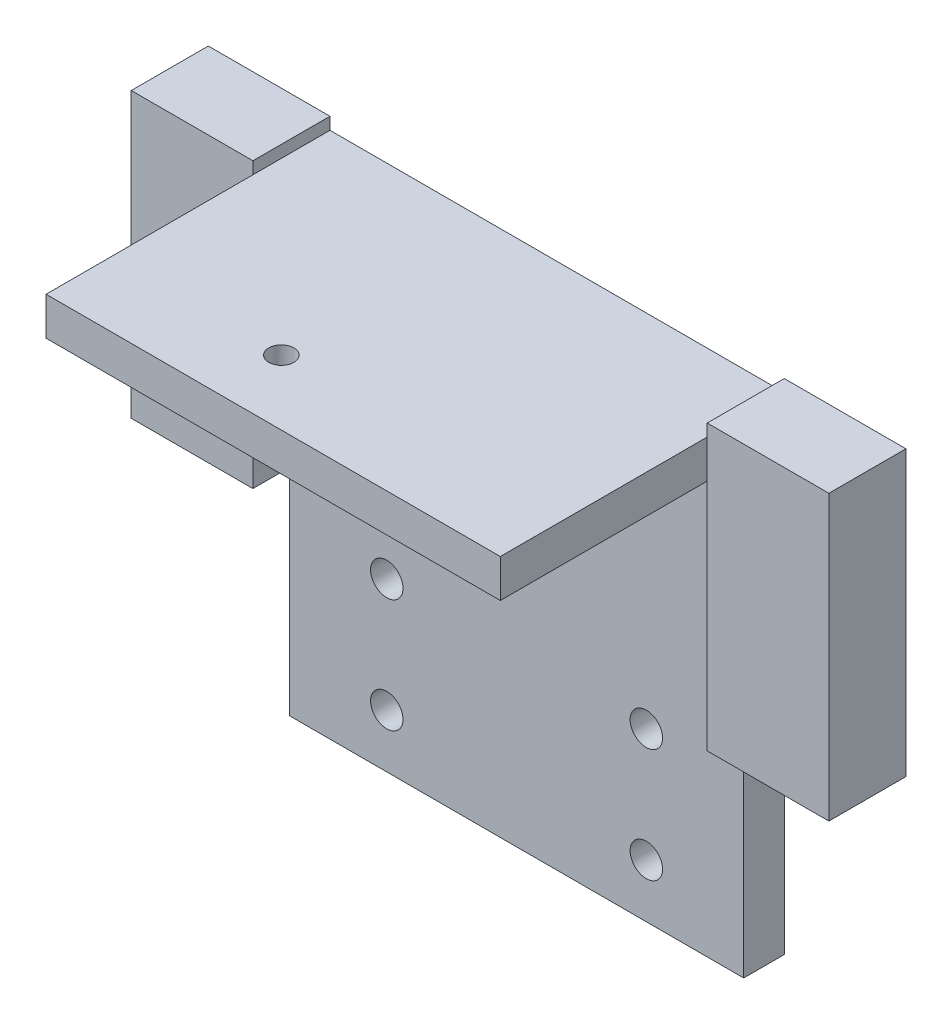
ISO-10303-21;
HEADER;
FILE_DESCRIPTION(('STEP AP214'),'2;1');
FILE_NAME('part.step','',(''),(''),'','','');
FILE_SCHEMA(('AUTOMOTIVE_DESIGN { 1 0 10303 214 1 1 1 1 }'));
ENDSEC;
DATA;
#1=APPLICATION_CONTEXT('core data for automotive mechanical design processes');
#2=APPLICATION_PROTOCOL_DEFINITION('international standard','automotive_design',2000,#1);
#3=PRODUCT_CONTEXT('',#1,'mechanical');
#4=PRODUCT('Part','Part','',(#3));
#5=PRODUCT_RELATED_PRODUCT_CATEGORY('part','',(#4));
#6=PRODUCT_DEFINITION_FORMATION('','',#4);
#7=PRODUCT_DEFINITION_CONTEXT('part definition',#1,'design');
#8=PRODUCT_DEFINITION('design','',#6,#7);
#9=PRODUCT_DEFINITION_SHAPE('','',#8);
#10=(LENGTH_UNIT() NAMED_UNIT(*) SI_UNIT(.MILLI.,.METRE.));
#11=(NAMED_UNIT(*) PLANE_ANGLE_UNIT() SI_UNIT($,.RADIAN.));
#12=(NAMED_UNIT(*) SI_UNIT($,.STERADIAN.) SOLID_ANGLE_UNIT());
#13=UNCERTAINTY_MEASURE_WITH_UNIT(LENGTH_MEASURE(1.E-05),#10,'distance_accuracy_value','');
#14=(GEOMETRIC_REPRESENTATION_CONTEXT(3) GLOBAL_UNCERTAINTY_ASSIGNED_CONTEXT((#13)) GLOBAL_UNIT_ASSIGNED_CONTEXT((#10,
#11,#12)) REPRESENTATION_CONTEXT('',''));
#15=CARTESIAN_POINT('',(0.,0.,0.));
#16=DIRECTION('',(0.,0.,1.));
#17=DIRECTION('',(1.,0.,0.));
#18=AXIS2_PLACEMENT_3D('',#15,#16,#17);
#19=CARTESIAN_POINT('',(28.,-30.,5.));
#20=DIRECTION('',(-1.,0.,0.));
#21=DIRECTION('',(0.,0.,1.));
#22=AXIS2_PLACEMENT_3D('',#19,#20,#21);
#23=PLANE('',#22);
#24=DIRECTION('',(0.,1.,0.));
#25=VECTOR('',#24,1.);
#26=CARTESIAN_POINT('',(28.,-30.,0.));
#27=LINE('',#26,#25);
#28=CARTESIAN_POINT('',(28.,-30.,0.));
#29=VERTEX_POINT('',#28);
#30=CARTESIAN_POINT('',(28.,-3.5,0.));
#31=VERTEX_POINT('',#30);
#32=EDGE_CURVE('E319',#29,#31,#27,.T.);
#33=ORIENTED_EDGE('',*,*,#32,.T.);
#34=DIRECTION('',(0.,0.,1.));
#35=VECTOR('',#34,1.);
#36=CARTESIAN_POINT('',(28.,-3.5,0.));
#37=LINE('',#36,#35);
#38=CARTESIAN_POINT('',(28.,-3.5,5.));
#39=VERTEX_POINT('',#38);
#40=EDGE_CURVE('E215',#31,#39,#37,.T.);
#41=ORIENTED_EDGE('',*,*,#40,.T.);
#42=DIRECTION('',(0.,1.,0.));
#43=VECTOR('',#42,1.);
#44=CARTESIAN_POINT('',(28.,-30.,5.));
#45=LINE('',#44,#43);
#46=CARTESIAN_POINT('',(28.,-30.,5.));
#47=VERTEX_POINT('',#46);
#48=EDGE_CURVE('E328',#47,#39,#45,.T.);
#49=ORIENTED_EDGE('',*,*,#48,.F.);
#50=DIRECTION('',(0.,0.,-1.));
#51=VECTOR('',#50,1.);
#52=CARTESIAN_POINT('',(28.,-30.,5.));
#53=LINE('',#52,#51);
#54=EDGE_CURVE('E337',#47,#29,#53,.T.);
#55=ORIENTED_EDGE('',*,*,#54,.T.);
#56=EDGE_LOOP('',(#33,#41,#49,#55));
#57=FACE_BOUND('',#56,.T.);
#58=ADVANCED_FACE('F39',(#57),#23,.F.);
#59=CARTESIAN_POINT('',(-28.,-30.,5.));
#60=DIRECTION('',(1.,0.,0.));
#61=DIRECTION('',(0.,0.,-1.));
#62=AXIS2_PLACEMENT_3D('',#59,#60,#61);
#63=PLANE('',#62);
#64=DIRECTION('',(0.,1.,0.));
#65=VECTOR('',#64,1.);
#66=CARTESIAN_POINT('',(-28.,-3.5,9.5));
#67=LINE('',#66,#65);
#68=CARTESIAN_POINT('',(-28.,25.3,9.5));
#69=VERTEX_POINT('',#68);
#70=CARTESIAN_POINT('',(-28.,30.,9.5));
#71=VERTEX_POINT('',#70);
#72=EDGE_CURVE('E48',#69,#71,#67,.T.);
#73=ORIENTED_EDGE('',*,*,#72,.F.);
#74=DIRECTION('',(0.,0.,-1.));
#75=VECTOR('',#74,1.);
#76=CARTESIAN_POINT('',(-28.,25.3,35.));
#77=LINE('',#76,#75);
#78=CARTESIAN_POINT('',(-28.,25.3,35.));
#79=VERTEX_POINT('',#78);
#80=EDGE_CURVE('E300',#79,#69,#77,.T.);
#81=ORIENTED_EDGE('',*,*,#80,.F.);
#82=DIRECTION('',(0.,-1.,0.));
#83=VECTOR('',#82,1.);
#84=CARTESIAN_POINT('',(-28.,30.,35.));
#85=LINE('',#84,#83);
#86=CARTESIAN_POINT('',(-28.,30.,35.));
#87=VERTEX_POINT('',#86);
#88=EDGE_CURVE('E281',#87,#79,#85,.T.);
#89=ORIENTED_EDGE('',*,*,#88,.F.);
#90=DIRECTION('',(0.,0.,-1.));
#91=VECTOR('',#90,1.);
#92=CARTESIAN_POINT('',(-28.,30.,5.));
#93=LINE('',#92,#91);
#94=EDGE_CURVE('E352',#87,#71,#93,.T.);
#95=ORIENTED_EDGE('',*,*,#94,.T.);
#96=EDGE_LOOP('',(#73,#81,#89,#95));
#97=FACE_BOUND('',#96,.T.);
#98=ADVANCED_FACE('F380',(#97),#63,.F.);
#99=DIRECTION('',(0.,0.,1.));
#100=VECTOR('',#99,1.);
#101=CARTESIAN_POINT('',(-28.,-3.5,0.));
#102=LINE('',#101,#100);
#103=CARTESIAN_POINT('',(-28.,-3.5,0.));
#104=VERTEX_POINT('',#103);
#105=CARTESIAN_POINT('',(-28.,-3.5,5.));
#106=VERTEX_POINT('',#105);
#107=EDGE_CURVE('E65',#104,#106,#102,.T.);
#108=ORIENTED_EDGE('',*,*,#107,.F.);
#109=DIRECTION('',(0.,-1.,0.));
#110=VECTOR('',#109,1.);
#111=CARTESIAN_POINT('',(-28.,-30.,0.));
#112=LINE('',#111,#110);
#113=CARTESIAN_POINT('',(-28.,-30.,0.));
#114=VERTEX_POINT('',#113);
#115=EDGE_CURVE('E342',#104,#114,#112,.T.);
#116=ORIENTED_EDGE('',*,*,#115,.T.);
#117=DIRECTION('',(0.,0.,-1.));
#118=VECTOR('',#117,1.);
#119=CARTESIAN_POINT('',(-28.,-30.,5.));
#120=LINE('',#119,#118);
#121=CARTESIAN_POINT('',(-28.,-30.,5.));
#122=VERTEX_POINT('',#121);
#123=EDGE_CURVE('E348',#122,#114,#120,.T.);
#124=ORIENTED_EDGE('',*,*,#123,.F.);
#125=DIRECTION('',(0.,-1.,0.));
#126=VECTOR('',#125,1.);
#127=CARTESIAN_POINT('',(-28.,-30.,5.));
#128=LINE('',#127,#126);
#129=EDGE_CURVE('E331',#106,#122,#128,.T.);
#130=ORIENTED_EDGE('',*,*,#129,.F.);
#131=EDGE_LOOP('',(#108,#116,#124,#130));
#132=FACE_BOUND('',#131,.T.);
#133=ADVANCED_FACE('F421',(#132),#63,.F.);
#134=CARTESIAN_POINT('',(0.,0.,5.));
#135=DIRECTION('',(0.,0.,-1.));
#136=DIRECTION('',(-1.,0.,0.));
#137=AXIS2_PLACEMENT_3D('',#134,#135,#136);
#138=PLANE('',#137);
#139=CARTESIAN_POINT('',(16.,-23.4,5.));
#140=DIRECTION('',(0.,0.,-1.));
#141=DIRECTION('',(-1.,0.,0.));
#142=AXIS2_PLACEMENT_3D('',#139,#140,#141);
#143=CIRCLE('',#142,2.);
#144=CARTESIAN_POINT('',(14.,-23.4,5.));
#145=VERTEX_POINT('',#144);
#146=EDGE_CURVE('E308',#145,#145,#143,.T.);
#147=ORIENTED_EDGE('',*,*,#146,.T.);
#148=EDGE_LOOP('',(#147));
#149=FACE_BOUND('',#148,.T.);
#150=CARTESIAN_POINT('',(16.,-9.4,5.));
#151=DIRECTION('',(0.,0.,-1.));
#152=DIRECTION('',(-1.,0.,0.));
#153=AXIS2_PLACEMENT_3D('',#150,#151,#152);
#154=CIRCLE('',#153,2.);
#155=CARTESIAN_POINT('',(14.,-9.4,5.));
#156=VERTEX_POINT('',#155);
#157=EDGE_CURVE('E303',#156,#156,#154,.T.);
#158=ORIENTED_EDGE('',*,*,#157,.T.);
#159=EDGE_LOOP('',(#158));
#160=FACE_BOUND('',#159,.T.);
#161=CARTESIAN_POINT('',(-16.,-23.4,5.));
#162=DIRECTION('',(0.,0.,1.));
#163=DIRECTION('',(1.,0.,0.));
#164=AXIS2_PLACEMENT_3D('',#161,#162,#163);
#165=CIRCLE('',#164,2.);
#166=CARTESIAN_POINT('',(-14.,-23.4,5.));
#167=VERTEX_POINT('',#166);
#168=EDGE_CURVE('E320',#167,#167,#165,.T.);
#169=ORIENTED_EDGE('',*,*,#168,.F.);
#170=EDGE_LOOP('',(#169));
#171=FACE_BOUND('',#170,.T.);
#172=CARTESIAN_POINT('',(-16.,-9.4,5.));
#173=DIRECTION('',(0.,0.,1.));
#174=DIRECTION('',(1.,0.,0.));
#175=AXIS2_PLACEMENT_3D('',#172,#173,#174);
#176=CIRCLE('',#175,2.);
#177=CARTESIAN_POINT('',(-14.,-9.4,5.));
#178=VERTEX_POINT('',#177);
#179=EDGE_CURVE('E323',#178,#178,#176,.T.);
#180=ORIENTED_EDGE('',*,*,#179,.F.);
#181=EDGE_LOOP('',(#180));
#182=FACE_BOUND('',#181,.T.);
#183=DIRECTION('',(1.,0.,0.));
#184=VECTOR('',#183,1.);
#185=CARTESIAN_POINT('',(-28.,1.3,5.));
#186=LINE('',#185,#184);
#187=CARTESIAN_POINT('',(-28.,1.3,5.));
#188=VERTEX_POINT('',#187);
#189=CARTESIAN_POINT('',(-3.,1.3,5.));
#190=VERTEX_POINT('',#189);
#191=EDGE_CURVE('E255',#188,#190,#186,.T.);
#192=ORIENTED_EDGE('',*,*,#191,.F.);
#193=EDGE_CURVE('E333',#188,#106,#128,.T.);
#194=ORIENTED_EDGE('',*,*,#193,.T.);
#195=ORIENTED_EDGE('',*,*,#129,.T.);
#196=DIRECTION('',(1.,0.,0.));
#197=VECTOR('',#196,1.);
#198=CARTESIAN_POINT('',(-28.,-30.,5.));
#199=LINE('',#198,#197);
#200=EDGE_CURVE('E335',#122,#47,#199,.T.);
#201=ORIENTED_EDGE('',*,*,#200,.T.);
#202=ORIENTED_EDGE('',*,*,#48,.T.);
#203=CARTESIAN_POINT('',(28.,25.3,5.));
#204=VERTEX_POINT('',#203);
#205=EDGE_CURVE('E332',#39,#204,#45,.T.);
#206=ORIENTED_EDGE('',*,*,#205,.T.);
#207=DIRECTION('',(1.,0.,0.));
#208=VECTOR('',#207,1.);
#209=CARTESIAN_POINT('',(-28.,25.3,5.));
#210=LINE('',#209,#208);
#211=CARTESIAN_POINT('',(-3.,25.3,5.));
#212=VERTEX_POINT('',#211);
#213=EDGE_CURVE('E285',#212,#204,#210,.T.);
#214=ORIENTED_EDGE('',*,*,#213,.F.);
#215=DIRECTION('',(0.,1.,0.));
#216=VECTOR('',#215,1.);
#217=CARTESIAN_POINT('',(-3.,25.3,5.));
#218=LINE('',#217,#216);
#219=EDGE_CURVE('E260',#190,#212,#218,.T.);
#220=ORIENTED_EDGE('',*,*,#219,.F.);
#221=EDGE_LOOP('',(#192,#194,#195,#201,#202,#206,#214,#220));
#222=FACE_BOUND('',#221,.T.);
#223=ADVANCED_FACE('F404',(#149,#160,#171,#182,#222),#138,.F.);
#224=CARTESIAN_POINT('',(-28.,25.3,35.));
#225=DIRECTION('',(0.,1.,0.));
#226=DIRECTION('',(0.,0.,1.));
#227=AXIS2_PLACEMENT_3D('',#224,#225,#226);
#228=PLANE('',#227);
#229=CARTESIAN_POINT('',(-7.,25.3,27.));
#230=DIRECTION('',(0.,1.,0.));
#231=DIRECTION('',(0.,0.,1.));
#232=AXIS2_PLACEMENT_3D('',#229,#230,#231);
#233=CIRCLE('',#232,1.55);
#234=CARTESIAN_POINT('',(-7.,25.3,28.55));
#235=VERTEX_POINT('',#234);
#236=EDGE_CURVE('E43',#235,#235,#233,.T.);
#237=ORIENTED_EDGE('',*,*,#236,.T.);
#238=EDGE_LOOP('',(#237));
#239=FACE_BOUND('',#238,.T.);
#240=DIRECTION('',(0.,0.,-1.));
#241=VECTOR('',#240,1.);
#242=CARTESIAN_POINT('',(-3.,25.3,9.3));
#243=LINE('',#242,#241);
#244=CARTESIAN_POINT('',(-3.,25.3,9.3));
#245=VERTEX_POINT('',#244);
#246=EDGE_CURVE('E268',#245,#212,#243,.T.);
#247=ORIENTED_EDGE('',*,*,#246,.T.);
#248=ORIENTED_EDGE('',*,*,#213,.T.);
#249=DIRECTION('',(0.,0.,-1.));
#250=VECTOR('',#249,1.);
#251=CARTESIAN_POINT('',(28.,25.3,35.));
#252=LINE('',#251,#250);
#253=CARTESIAN_POINT('',(28.,25.3,9.5));
#254=VERTEX_POINT('',#253);
#255=EDGE_CURVE('E293',#254,#204,#252,.T.);
#256=ORIENTED_EDGE('',*,*,#255,.F.);
#257=CARTESIAN_POINT('',(28.,25.3,35.));
#258=VERTEX_POINT('',#257);
#259=EDGE_CURVE('E296',#258,#254,#252,.T.);
#260=ORIENTED_EDGE('',*,*,#259,.F.);
#261=DIRECTION('',(1.,0.,0.));
#262=VECTOR('',#261,1.);
#263=CARTESIAN_POINT('',(-28.,25.3,35.));
#264=LINE('',#263,#262);
#265=EDGE_CURVE('E284',#79,#258,#264,.T.);
#266=ORIENTED_EDGE('',*,*,#265,.F.);
#267=ORIENTED_EDGE('',*,*,#80,.T.);
#268=CARTESIAN_POINT('',(-28.,25.3,9.3));
#269=VERTEX_POINT('',#268);
#270=EDGE_CURVE('E299',#69,#269,#77,.T.);
#271=ORIENTED_EDGE('',*,*,#270,.T.);
#272=DIRECTION('',(-1.,0.,0.));
#273=VECTOR('',#272,1.);
#274=CARTESIAN_POINT('',(-28.,25.3,9.3));
#275=LINE('',#274,#273);
#276=EDGE_CURVE('E265',#245,#269,#275,.T.);
#277=ORIENTED_EDGE('',*,*,#276,.F.);
#278=EDGE_LOOP('',(#247,#248,#256,#260,#266,#267,#271,#277));
#279=FACE_BOUND('',#278,.T.);
#280=ADVANCED_FACE('F384',(#239,#279),#228,.F.);
#281=ORIENTED_EDGE('',*,*,#259,.T.);
#282=DIRECTION('',(0.,1.,0.));
#283=VECTOR('',#282,1.);
#284=CARTESIAN_POINT('',(28.,-3.5,9.5));
#285=LINE('',#284,#283);
#286=CARTESIAN_POINT('',(28.,30.,9.5));
#287=VERTEX_POINT('',#286);
#288=EDGE_CURVE('E11',#254,#287,#285,.T.);
#289=ORIENTED_EDGE('',*,*,#288,.T.);
#290=DIRECTION('',(0.,0.,-1.));
#291=VECTOR('',#290,1.);
#292=CARTESIAN_POINT('',(28.,30.,5.));
#293=LINE('',#292,#291);
#294=CARTESIAN_POINT('',(28.,30.,35.));
#295=VERTEX_POINT('',#294);
#296=EDGE_CURVE('E355',#295,#287,#293,.T.);
#297=ORIENTED_EDGE('',*,*,#296,.F.);
#298=DIRECTION('',(0.,1.,0.));
#299=VECTOR('',#298,1.);
#300=CARTESIAN_POINT('',(28.,30.,35.));
#301=LINE('',#300,#299);
#302=EDGE_CURVE('E287',#258,#295,#301,.T.);
#303=ORIENTED_EDGE('',*,*,#302,.F.);
#304=EDGE_LOOP('',(#281,#289,#297,#303));
#305=FACE_BOUND('',#304,.T.);
#306=ADVANCED_FACE('F41',(#305),#23,.F.);
#307=CARTESIAN_POINT('',(-28.,30.,5.));
#308=DIRECTION('',(0.,-1.,0.));
#309=DIRECTION('',(0.,0.,-1.));
#310=AXIS2_PLACEMENT_3D('',#307,#308,#309);
#311=PLANE('',#310);
#312=CARTESIAN_POINT('',(-7.,30.,27.));
#313=DIRECTION('',(0.,1.,0.));
#314=DIRECTION('',(0.,0.,1.));
#315=AXIS2_PLACEMENT_3D('',#312,#313,#314);
#316=CIRCLE('',#315,1.55);
#317=CARTESIAN_POINT('',(-7.,30.,28.55));
#318=VERTEX_POINT('',#317);
#319=EDGE_CURVE('E278',#318,#318,#316,.T.);
#320=ORIENTED_EDGE('',*,*,#319,.F.);
#321=EDGE_LOOP('',(#320));
#322=FACE_BOUND('',#321,.T.);
#323=DIRECTION('',(-1.,0.,0.));
#324=VECTOR('',#323,1.);
#325=CARTESIAN_POINT('',(-28.,30.,0.));
#326=LINE('',#325,#324);
#327=CARTESIAN_POINT('',(28.,30.,0.));
#328=VERTEX_POINT('',#327);
#329=CARTESIAN_POINT('',(-28.,30.,0.));
#330=VERTEX_POINT('',#329);
#331=EDGE_CURVE('E340',#328,#330,#326,.T.);
#332=ORIENTED_EDGE('',*,*,#331,.T.);
#333=EDGE_CURVE('E351',#71,#330,#93,.T.);
#334=ORIENTED_EDGE('',*,*,#333,.F.);
#335=ORIENTED_EDGE('',*,*,#94,.F.);
#336=DIRECTION('',(-1.,0.,0.));
#337=VECTOR('',#336,1.);
#338=CARTESIAN_POINT('',(-28.,30.,35.));
#339=LINE('',#338,#337);
#340=EDGE_CURVE('E290',#295,#87,#339,.T.);
#341=ORIENTED_EDGE('',*,*,#340,.F.);
#342=ORIENTED_EDGE('',*,*,#296,.T.);
#343=EDGE_CURVE('E354',#287,#328,#293,.T.);
#344=ORIENTED_EDGE('',*,*,#343,.T.);
#345=EDGE_LOOP('',(#332,#334,#335,#341,#342,#344));
#346=FACE_BOUND('',#345,.T.);
#347=ADVANCED_FACE('F361',(#322,#346),#311,.F.);
#348=CARTESIAN_POINT('',(-28.,-30.,5.));
#349=DIRECTION('',(0.,1.,0.));
#350=DIRECTION('',(0.,0.,1.));
#351=AXIS2_PLACEMENT_3D('',#348,#349,#350);
#352=PLANE('',#351);
#353=DIRECTION('',(1.,0.,0.));
#354=VECTOR('',#353,1.);
#355=CARTESIAN_POINT('',(-28.,-30.,0.));
#356=LINE('',#355,#354);
#357=EDGE_CURVE('E344',#114,#29,#356,.T.);
#358=ORIENTED_EDGE('',*,*,#357,.T.);
#359=ORIENTED_EDGE('',*,*,#54,.F.);
#360=ORIENTED_EDGE('',*,*,#200,.F.);
#361=ORIENTED_EDGE('',*,*,#123,.T.);
#362=EDGE_LOOP('',(#358,#359,#360,#361));
#363=FACE_BOUND('',#362,.T.);
#364=ADVANCED_FACE('F418',(#363),#352,.F.);
#365=CARTESIAN_POINT('',(0.,0.,0.));
#366=DIRECTION('',(0.,0.,-1.));
#367=DIRECTION('',(-1.,0.,0.));
#368=AXIS2_PLACEMENT_3D('',#365,#366,#367);
#369=PLANE('',#368);
#370=CARTESIAN_POINT('',(16.,-23.4,0.));
#371=DIRECTION('',(0.,0.,-1.));
#372=DIRECTION('',(-1.,0.,0.));
#373=AXIS2_PLACEMENT_3D('',#370,#371,#372);
#374=CIRCLE('',#373,2.);
#375=CARTESIAN_POINT('',(14.,-23.4,0.));
#376=VERTEX_POINT('',#375);
#377=EDGE_CURVE('E304',#376,#376,#374,.T.);
#378=ORIENTED_EDGE('',*,*,#377,.F.);
#379=EDGE_LOOP('',(#378));
#380=FACE_BOUND('',#379,.T.);
#381=CARTESIAN_POINT('',(16.,-9.4,0.));
#382=DIRECTION('',(0.,0.,-1.));
#383=DIRECTION('',(-1.,0.,0.));
#384=AXIS2_PLACEMENT_3D('',#381,#382,#383);
#385=CIRCLE('',#384,2.);
#386=CARTESIAN_POINT('',(14.,-9.4,0.));
#387=VERTEX_POINT('',#386);
#388=EDGE_CURVE('E311',#387,#387,#385,.T.);
#389=ORIENTED_EDGE('',*,*,#388,.F.);
#390=EDGE_LOOP('',(#389));
#391=FACE_BOUND('',#390,.T.);
#392=CARTESIAN_POINT('',(-16.,-23.4,0.));
#393=DIRECTION('',(0.,0.,1.));
#394=DIRECTION('',(1.,0.,0.));
#395=AXIS2_PLACEMENT_3D('',#392,#393,#394);
#396=CIRCLE('',#395,2.);
#397=CARTESIAN_POINT('',(-14.,-23.4,0.));
#398=VERTEX_POINT('',#397);
#399=EDGE_CURVE('E316',#398,#398,#396,.T.);
#400=ORIENTED_EDGE('',*,*,#399,.T.);
#401=EDGE_LOOP('',(#400));
#402=FACE_BOUND('',#401,.T.);
#403=CARTESIAN_POINT('',(-16.,-9.4,0.));
#404=DIRECTION('',(0.,0.,1.));
#405=DIRECTION('',(1.,0.,0.));
#406=AXIS2_PLACEMENT_3D('',#403,#404,#405);
#407=CIRCLE('',#406,2.);
#408=CARTESIAN_POINT('',(-14.,-9.4,0.));
#409=VERTEX_POINT('',#408);
#410=EDGE_CURVE('E307',#409,#409,#407,.T.);
#411=ORIENTED_EDGE('',*,*,#410,.T.);
#412=EDGE_LOOP('',(#411));
#413=FACE_BOUND('',#412,.T.);
#414=ORIENTED_EDGE('',*,*,#32,.F.);
#415=ORIENTED_EDGE('',*,*,#357,.F.);
#416=ORIENTED_EDGE('',*,*,#115,.F.);
#417=DIRECTION('',(1.,0.,0.));
#418=VECTOR('',#417,1.);
#419=CARTESIAN_POINT('',(-43.,-3.5,0.));
#420=LINE('',#419,#418);
#421=CARTESIAN_POINT('',(-43.,-3.5,0.));
#422=VERTEX_POINT('',#421);
#423=EDGE_CURVE('E252',#422,#104,#420,.T.);
#424=ORIENTED_EDGE('',*,*,#423,.F.);
#425=DIRECTION('',(0.,-1.,0.));
#426=VECTOR('',#425,1.);
#427=CARTESIAN_POINT('',(-43.,31.5,0.));
#428=LINE('',#427,#426);
#429=CARTESIAN_POINT('',(-43.,31.5,0.));
#430=VERTEX_POINT('',#429);
#431=EDGE_CURVE('E224',#430,#422,#428,.T.);
#432=ORIENTED_EDGE('',*,*,#431,.F.);
#433=DIRECTION('',(1.,0.,0.));
#434=VECTOR('',#433,1.);
#435=CARTESIAN_POINT('',(-43.,31.5,0.));
#436=LINE('',#435,#434);
#437=CARTESIAN_POINT('',(-28.,31.5,0.));
#438=VERTEX_POINT('',#437);
#439=EDGE_CURVE('E233',#430,#438,#436,.T.);
#440=ORIENTED_EDGE('',*,*,#439,.T.);
#441=DIRECTION('',(0.,-1.,0.));
#442=VECTOR('',#441,1.);
#443=CARTESIAN_POINT('',(-28.,26.5,0.));
#444=LINE('',#443,#442);
#445=EDGE_CURVE('E191',#438,#330,#444,.T.);
#446=ORIENTED_EDGE('',*,*,#445,.T.);
#447=ORIENTED_EDGE('',*,*,#331,.F.);
#448=DIRECTION('',(0.,-1.,0.));
#449=VECTOR('',#448,1.);
#450=CARTESIAN_POINT('',(28.,26.5,0.));
#451=LINE('',#450,#449);
#452=CARTESIAN_POINT('',(28.,31.5,0.));
#453=VERTEX_POINT('',#452);
#454=EDGE_CURVE('E186',#453,#328,#451,.T.);
#455=ORIENTED_EDGE('',*,*,#454,.F.);
#456=DIRECTION('',(-1.,0.,0.));
#457=VECTOR('',#456,1.);
#458=CARTESIAN_POINT('',(43.,31.5,0.));
#459=LINE('',#458,#457);
#460=CARTESIAN_POINT('',(43.,31.5,0.));
#461=VERTEX_POINT('',#460);
#462=EDGE_CURVE('E179',#461,#453,#459,.T.);
#463=ORIENTED_EDGE('',*,*,#462,.F.);
#464=DIRECTION('',(0.,-1.,0.));
#465=VECTOR('',#464,1.);
#466=CARTESIAN_POINT('',(43.,31.5,0.));
#467=LINE('',#466,#465);
#468=CARTESIAN_POINT('',(43.,-3.5,0.));
#469=VERTEX_POINT('',#468);
#470=EDGE_CURVE('E183',#461,#469,#467,.T.);
#471=ORIENTED_EDGE('',*,*,#470,.T.);
#472=DIRECTION('',(-1.,0.,0.));
#473=VECTOR('',#472,1.);
#474=CARTESIAN_POINT('',(43.,-3.5,0.));
#475=LINE('',#474,#473);
#476=EDGE_CURVE('E210',#469,#31,#475,.T.);
#477=ORIENTED_EDGE('',*,*,#476,.T.);
#478=EDGE_LOOP('',(#414,#415,#416,#424,#432,#440,#446,#447,#455,#463,#471,#477));
#479=FACE_BOUND('',#478,.T.);
#480=ADVANCED_FACE('F182',(#380,#391,#402,#413,#479),#369,.T.);
#481=CARTESIAN_POINT('',(-16.,-9.4,0.));
#482=DIRECTION('',(0.,0.,1.));
#483=DIRECTION('',(1.,0.,0.));
#484=AXIS2_PLACEMENT_3D('',#481,#482,#483);
#485=CYLINDRICAL_SURFACE('',#484,2.);
#486=ORIENTED_EDGE('',*,*,#410,.F.);
#487=EDGE_LOOP('',(#486));
#488=FACE_BOUND('',#487,.T.);
#489=ORIENTED_EDGE('',*,*,#179,.T.);
#490=EDGE_LOOP('',(#489));
#491=FACE_BOUND('',#490,.T.);
#492=ADVANCED_FACE('F476',(#488,#491),#485,.F.);
#493=CARTESIAN_POINT('',(-16.,-23.4,0.));
#494=DIRECTION('',(0.,0.,1.));
#495=DIRECTION('',(1.,0.,0.));
#496=AXIS2_PLACEMENT_3D('',#493,#494,#495);
#497=CYLINDRICAL_SURFACE('',#496,2.);
#498=ORIENTED_EDGE('',*,*,#399,.F.);
#499=EDGE_LOOP('',(#498));
#500=FACE_BOUND('',#499,.T.);
#501=ORIENTED_EDGE('',*,*,#168,.T.);
#502=EDGE_LOOP('',(#501));
#503=FACE_BOUND('',#502,.T.);
#504=ADVANCED_FACE('F472',(#500,#503),#497,.F.);
#505=CARTESIAN_POINT('',(16.,-9.4,0.));
#506=DIRECTION('',(0.,0.,1.));
#507=DIRECTION('',(1.,0.,0.));
#508=AXIS2_PLACEMENT_3D('',#505,#506,#507);
#509=CYLINDRICAL_SURFACE('',#508,2.);
#510=ORIENTED_EDGE('',*,*,#388,.T.);
#511=EDGE_LOOP('',(#510));
#512=FACE_BOUND('',#511,.T.);
#513=ORIENTED_EDGE('',*,*,#157,.F.);
#514=EDGE_LOOP('',(#513));
#515=FACE_BOUND('',#514,.T.);
#516=ADVANCED_FACE('F465',(#512,#515),#509,.F.);
#517=CARTESIAN_POINT('',(16.,-23.4,0.));
#518=DIRECTION('',(0.,0.,1.));
#519=DIRECTION('',(1.,0.,0.));
#520=AXIS2_PLACEMENT_3D('',#517,#518,#519);
#521=CYLINDRICAL_SURFACE('',#520,2.);
#522=ORIENTED_EDGE('',*,*,#377,.T.);
#523=EDGE_LOOP('',(#522));
#524=FACE_BOUND('',#523,.T.);
#525=ORIENTED_EDGE('',*,*,#146,.F.);
#526=EDGE_LOOP('',(#525));
#527=FACE_BOUND('',#526,.T.);
#528=ADVANCED_FACE('F456',(#524,#527),#521,.F.);
#529=CARTESIAN_POINT('',(0.,0.,35.));
#530=DIRECTION('',(0.,0.,1.));
#531=DIRECTION('',(1.,0.,0.));
#532=AXIS2_PLACEMENT_3D('',#529,#530,#531);
#533=PLANE('',#532);
#534=ORIENTED_EDGE('',*,*,#88,.T.);
#535=ORIENTED_EDGE('',*,*,#265,.T.);
#536=ORIENTED_EDGE('',*,*,#302,.T.);
#537=ORIENTED_EDGE('',*,*,#340,.T.);
#538=EDGE_LOOP('',(#534,#535,#536,#537));
#539=FACE_BOUND('',#538,.T.);
#540=ADVANCED_FACE('F453',(#539),#533,.T.);
#541=CARTESIAN_POINT('',(-7.,-10.,27.));
#542=DIRECTION('',(0.,1.,0.));
#543=DIRECTION('',(0.,0.,1.));
#544=AXIS2_PLACEMENT_3D('',#541,#542,#543);
#545=CYLINDRICAL_SURFACE('',#544,1.55);
#546=ORIENTED_EDGE('',*,*,#319,.T.);
#547=EDGE_LOOP('',(#546));
#548=FACE_BOUND('',#547,.T.);
#549=ORIENTED_EDGE('',*,*,#236,.F.);
#550=EDGE_LOOP('',(#549));
#551=FACE_BOUND('',#550,.T.);
#552=ADVANCED_FACE('F455',(#548,#551),#545,.F.);
#553=CARTESIAN_POINT('',(-28.,1.3,9.3));
#554=DIRECTION('',(0.,1.,0.));
#555=DIRECTION('',(0.,0.,1.));
#556=AXIS2_PLACEMENT_3D('',#553,#554,#555);
#557=PLANE('',#556);
#558=ORIENTED_EDGE('',*,*,#191,.T.);
#559=DIRECTION('',(0.,0.,-1.));
#560=VECTOR('',#559,1.);
#561=CARTESIAN_POINT('',(-3.,1.3,9.3));
#562=LINE('',#561,#560);
#563=CARTESIAN_POINT('',(-3.,1.3,9.3));
#564=VERTEX_POINT('',#563);
#565=EDGE_CURVE('E273',#564,#190,#562,.T.);
#566=ORIENTED_EDGE('',*,*,#565,.F.);
#567=DIRECTION('',(1.,0.,0.));
#568=VECTOR('',#567,1.);
#569=CARTESIAN_POINT('',(-28.,1.3,9.3));
#570=LINE('',#569,#568);
#571=CARTESIAN_POINT('',(-28.,1.3,9.3));
#572=VERTEX_POINT('',#571);
#573=EDGE_CURVE('E259',#572,#564,#570,.T.);
#574=ORIENTED_EDGE('',*,*,#573,.F.);
#575=DIRECTION('',(0.,0.,-1.));
#576=VECTOR('',#575,1.);
#577=CARTESIAN_POINT('',(-28.,1.3,9.3));
#578=LINE('',#577,#576);
#579=EDGE_CURVE('E276',#572,#188,#578,.T.);
#580=ORIENTED_EDGE('',*,*,#579,.T.);
#581=EDGE_LOOP('',(#558,#566,#574,#580));
#582=FACE_BOUND('',#581,.T.);
#583=ADVANCED_FACE('F462',(#582),#557,.F.);
#584=CARTESIAN_POINT('',(-3.,25.3,9.3));
#585=DIRECTION('',(-1.,0.,0.));
#586=DIRECTION('',(0.,-1.,0.));
#587=AXIS2_PLACEMENT_3D('',#584,#585,#586);
#588=PLANE('',#587);
#589=ORIENTED_EDGE('',*,*,#219,.T.);
#590=ORIENTED_EDGE('',*,*,#246,.F.);
#591=DIRECTION('',(0.,1.,0.));
#592=VECTOR('',#591,1.);
#593=CARTESIAN_POINT('',(-3.,25.3,9.3));
#594=LINE('',#593,#592);
#595=EDGE_CURVE('E262',#564,#245,#594,.T.);
#596=ORIENTED_EDGE('',*,*,#595,.F.);
#597=ORIENTED_EDGE('',*,*,#565,.T.);
#598=EDGE_LOOP('',(#589,#590,#596,#597));
#599=FACE_BOUND('',#598,.T.);
#600=ADVANCED_FACE('F532',(#599),#588,.F.);
#601=CARTESIAN_POINT('',(0.,0.,9.3));
#602=DIRECTION('',(0.,0.,1.));
#603=DIRECTION('',(1.,0.,0.));
#604=AXIS2_PLACEMENT_3D('',#601,#602,#603);
#605=PLANE('',#604);
#606=DIRECTION('',(0.,-1.,0.));
#607=VECTOR('',#606,1.);
#608=CARTESIAN_POINT('',(-28.,25.3,9.3));
#609=LINE('',#608,#607);
#610=EDGE_CURVE('E256',#269,#572,#609,.T.);
#611=ORIENTED_EDGE('',*,*,#610,.T.);
#612=ORIENTED_EDGE('',*,*,#573,.T.);
#613=ORIENTED_EDGE('',*,*,#595,.T.);
#614=ORIENTED_EDGE('',*,*,#276,.T.);
#615=EDGE_LOOP('',(#611,#612,#613,#614));
#616=FACE_BOUND('',#615,.T.);
#617=ADVANCED_FACE('F394',(#616),#605,.T.);
#618=CARTESIAN_POINT('',(-28.,0.,0.));
#619=DIRECTION('',(-1.,0.,0.));
#620=DIRECTION('',(0.,0.,1.));
#621=AXIS2_PLACEMENT_3D('',#618,#619,#620);
#622=PLANE('',#621);
#623=CARTESIAN_POINT('',(-28.,31.5,9.5));
#624=VERTEX_POINT('',#623);
#625=EDGE_CURVE('E238',#71,#624,#67,.T.);
#626=ORIENTED_EDGE('',*,*,#625,.F.);
#627=ORIENTED_EDGE('',*,*,#333,.T.);
#628=ORIENTED_EDGE('',*,*,#445,.F.);
#629=DIRECTION('',(0.,0.,-1.));
#630=VECTOR('',#629,1.);
#631=CARTESIAN_POINT('',(-28.,31.5,9.5));
#632=LINE('',#631,#630);
#633=EDGE_CURVE('E227',#624,#438,#632,.T.);
#634=ORIENTED_EDGE('',*,*,#633,.F.);
#635=EDGE_LOOP('',(#626,#627,#628,#634));
#636=FACE_BOUND('',#635,.T.);
#637=ADVANCED_FACE('F369',(#636),#622,.F.);
#638=CARTESIAN_POINT('',(-43.,-3.5,0.));
#639=DIRECTION('',(0.,1.,0.));
#640=DIRECTION('',(0.,0.,1.));
#641=AXIS2_PLACEMENT_3D('',#638,#639,#640);
#642=PLANE('',#641);
#643=ORIENTED_EDGE('',*,*,#107,.T.);
#644=CARTESIAN_POINT('',(-28.,-3.5,9.5));
#645=VERTEX_POINT('',#644);
#646=EDGE_CURVE('E236',#106,#645,#102,.T.);
#647=ORIENTED_EDGE('',*,*,#646,.T.);
#648=DIRECTION('',(1.,0.,0.));
#649=VECTOR('',#648,1.);
#650=CARTESIAN_POINT('',(-43.,-3.5,9.5));
#651=LINE('',#650,#649);
#652=CARTESIAN_POINT('',(-43.,-3.5,9.5));
#653=VERTEX_POINT('',#652);
#654=EDGE_CURVE('E249',#653,#645,#651,.T.);
#655=ORIENTED_EDGE('',*,*,#654,.F.);
#656=DIRECTION('',(0.,0.,1.));
#657=VECTOR('',#656,1.);
#658=CARTESIAN_POINT('',(-43.,-3.5,0.));
#659=LINE('',#658,#657);
#660=EDGE_CURVE('E226',#422,#653,#659,.T.);
#661=ORIENTED_EDGE('',*,*,#660,.F.);
#662=ORIENTED_EDGE('',*,*,#423,.T.);
#663=EDGE_LOOP('',(#643,#647,#655,#661,#662));
#664=FACE_BOUND('',#663,.T.);
#665=ADVANCED_FACE('F424',(#664),#642,.F.);
#666=CARTESIAN_POINT('',(-43.,-3.5,9.5));
#667=DIRECTION('',(0.,0.,-1.));
#668=DIRECTION('',(0.,1.,0.));
#669=AXIS2_PLACEMENT_3D('',#666,#667,#668);
#670=PLANE('',#669);
#671=EDGE_CURVE('E239',#645,#69,#67,.T.);
#672=ORIENTED_EDGE('',*,*,#671,.T.);
#673=ORIENTED_EDGE('',*,*,#72,.T.);
#674=ORIENTED_EDGE('',*,*,#625,.T.);
#675=DIRECTION('',(1.,0.,0.));
#676=VECTOR('',#675,1.);
#677=CARTESIAN_POINT('',(-43.,31.5,9.5));
#678=LINE('',#677,#676);
#679=CARTESIAN_POINT('',(-43.,31.5,9.5));
#680=VERTEX_POINT('',#679);
#681=EDGE_CURVE('E246',#680,#624,#678,.T.);
#682=ORIENTED_EDGE('',*,*,#681,.F.);
#683=DIRECTION('',(0.,1.,0.));
#684=VECTOR('',#683,1.);
#685=CARTESIAN_POINT('',(-43.,-3.5,9.5));
#686=LINE('',#685,#684);
#687=EDGE_CURVE('E229',#653,#680,#686,.T.);
#688=ORIENTED_EDGE('',*,*,#687,.F.);
#689=ORIENTED_EDGE('',*,*,#654,.T.);
#690=EDGE_LOOP('',(#672,#673,#674,#682,#688,#689));
#691=FACE_BOUND('',#690,.T.);
#692=ADVANCED_FACE('F376',(#691),#670,.F.);
#693=CARTESIAN_POINT('',(-43.,31.5,9.5));
#694=DIRECTION('',(0.,-1.,0.));
#695=DIRECTION('',(0.,0.,-1.));
#696=AXIS2_PLACEMENT_3D('',#693,#694,#695);
#697=PLANE('',#696);
#698=ORIENTED_EDGE('',*,*,#633,.T.);
#699=ORIENTED_EDGE('',*,*,#439,.F.);
#700=DIRECTION('',(0.,0.,-1.));
#701=VECTOR('',#700,1.);
#702=CARTESIAN_POINT('',(-43.,31.5,9.5));
#703=LINE('',#702,#701);
#704=EDGE_CURVE('E231',#680,#430,#703,.T.);
#705=ORIENTED_EDGE('',*,*,#704,.F.);
#706=ORIENTED_EDGE('',*,*,#681,.T.);
#707=EDGE_LOOP('',(#698,#699,#705,#706));
#708=FACE_BOUND('',#707,.T.);
#709=ADVANCED_FACE('F371',(#708),#697,.F.);
#710=CARTESIAN_POINT('',(-43.,0.,0.));
#711=DIRECTION('',(-1.,0.,0.));
#712=DIRECTION('',(0.,0.,1.));
#713=AXIS2_PLACEMENT_3D('',#710,#711,#712);
#714=PLANE('',#713);
#715=ORIENTED_EDGE('',*,*,#431,.T.);
#716=ORIENTED_EDGE('',*,*,#660,.T.);
#717=ORIENTED_EDGE('',*,*,#687,.T.);
#718=ORIENTED_EDGE('',*,*,#704,.T.);
#719=EDGE_LOOP('',(#715,#716,#717,#718));
#720=FACE_BOUND('',#719,.T.);
#721=ADVANCED_FACE('F427',(#720),#714,.T.);
#722=ORIENTED_EDGE('',*,*,#193,.F.);
#723=ORIENTED_EDGE('',*,*,#579,.F.);
#724=ORIENTED_EDGE('',*,*,#610,.F.);
#725=ORIENTED_EDGE('',*,*,#270,.F.);
#726=ORIENTED_EDGE('',*,*,#671,.F.);
#727=ORIENTED_EDGE('',*,*,#646,.F.);
#728=EDGE_LOOP('',(#722,#723,#724,#725,#726,#727));
#729=FACE_BOUND('',#728,.T.);
#730=ADVANCED_FACE('F390',(#729),#622,.F.);
#731=CARTESIAN_POINT('',(28.,0.,0.));
#732=DIRECTION('',(1.,0.,0.));
#733=DIRECTION('',(0.,0.,1.));
#734=AXIS2_PLACEMENT_3D('',#731,#732,#733);
#735=PLANE('',#734);
#736=CARTESIAN_POINT('',(28.,-3.5,9.5));
#737=VERTEX_POINT('',#736);
#738=EDGE_CURVE('E50',#737,#254,#285,.T.);
#739=ORIENTED_EDGE('',*,*,#738,.T.);
#740=ORIENTED_EDGE('',*,*,#255,.T.);
#741=ORIENTED_EDGE('',*,*,#205,.F.);
#742=EDGE_CURVE('E214',#39,#737,#37,.T.);
#743=ORIENTED_EDGE('',*,*,#742,.T.);
#744=EDGE_LOOP('',(#739,#740,#741,#743));
#745=FACE_BOUND('',#744,.T.);
#746=ADVANCED_FACE('F408',(#745),#735,.F.);
#747=CARTESIAN_POINT('',(43.,31.5,9.5));
#748=DIRECTION('',(0.,1.,0.));
#749=DIRECTION('',(0.,0.,1.));
#750=AXIS2_PLACEMENT_3D('',#747,#748,#749);
#751=PLANE('',#750);
#752=DIRECTION('',(0.,0.,-1.));
#753=VECTOR('',#752,1.);
#754=CARTESIAN_POINT('',(28.,31.5,9.5));
#755=LINE('',#754,#753);
#756=CARTESIAN_POINT('',(28.,31.5,9.5));
#757=VERTEX_POINT('',#756);
#758=EDGE_CURVE('E211',#757,#453,#755,.T.);
#759=ORIENTED_EDGE('',*,*,#758,.F.);
#760=DIRECTION('',(-1.,0.,0.));
#761=VECTOR('',#760,1.);
#762=CARTESIAN_POINT('',(43.,31.5,9.5));
#763=LINE('',#762,#761);
#764=CARTESIAN_POINT('',(43.,31.5,9.5));
#765=VERTEX_POINT('',#764);
#766=EDGE_CURVE('E192',#765,#757,#763,.T.);
#767=ORIENTED_EDGE('',*,*,#766,.F.);
#768=DIRECTION('',(0.,0.,-1.));
#769=VECTOR('',#768,1.);
#770=CARTESIAN_POINT('',(43.,31.5,9.5));
#771=LINE('',#770,#769);
#772=EDGE_CURVE('E199',#765,#461,#771,.T.);
#773=ORIENTED_EDGE('',*,*,#772,.T.);
#774=ORIENTED_EDGE('',*,*,#462,.T.);
#775=EDGE_LOOP('',(#759,#767,#773,#774));
#776=FACE_BOUND('',#775,.T.);
#777=ADVANCED_FACE('F204',(#776),#751,.T.);
#778=CARTESIAN_POINT('',(43.,-3.5,9.5));
#779=DIRECTION('',(0.,0.,1.));
#780=DIRECTION('',(0.,-1.,0.));
#781=AXIS2_PLACEMENT_3D('',#778,#779,#780);
#782=PLANE('',#781);
#783=ORIENTED_EDGE('',*,*,#738,.F.);
#784=DIRECTION('',(-1.,0.,0.));
#785=VECTOR('',#784,1.);
#786=CARTESIAN_POINT('',(43.,-3.5,9.5));
#787=LINE('',#786,#785);
#788=CARTESIAN_POINT('',(43.,-3.5,9.5));
#789=VERTEX_POINT('',#788);
#790=EDGE_CURVE('E220',#789,#737,#787,.T.);
#791=ORIENTED_EDGE('',*,*,#790,.F.);
#792=DIRECTION('',(0.,1.,0.));
#793=VECTOR('',#792,1.);
#794=CARTESIAN_POINT('',(43.,-3.5,9.5));
#795=LINE('',#794,#793);
#796=EDGE_CURVE('E205',#789,#765,#795,.T.);
#797=ORIENTED_EDGE('',*,*,#796,.T.);
#798=ORIENTED_EDGE('',*,*,#766,.T.);
#799=EDGE_CURVE('E51',#287,#757,#285,.T.);
#800=ORIENTED_EDGE('',*,*,#799,.F.);
#801=ORIENTED_EDGE('',*,*,#288,.F.);
#802=EDGE_LOOP('',(#783,#791,#797,#798,#800,#801));
#803=FACE_BOUND('',#802,.T.);
#804=ADVANCED_FACE('F703',(#803),#782,.T.);
#805=CARTESIAN_POINT('',(43.,-3.5,0.));
#806=DIRECTION('',(0.,-1.,0.));
#807=DIRECTION('',(0.,0.,-1.));
#808=AXIS2_PLACEMENT_3D('',#805,#806,#807);
#809=PLANE('',#808);
#810=ORIENTED_EDGE('',*,*,#40,.F.);
#811=ORIENTED_EDGE('',*,*,#476,.F.);
#812=DIRECTION('',(0.,0.,1.));
#813=VECTOR('',#812,1.);
#814=CARTESIAN_POINT('',(43.,-3.5,0.));
#815=LINE('',#814,#813);
#816=EDGE_CURVE('E202',#469,#789,#815,.T.);
#817=ORIENTED_EDGE('',*,*,#816,.T.);
#818=ORIENTED_EDGE('',*,*,#790,.T.);
#819=ORIENTED_EDGE('',*,*,#742,.F.);
#820=EDGE_LOOP('',(#810,#811,#817,#818,#819));
#821=FACE_BOUND('',#820,.T.);
#822=ADVANCED_FACE('F411',(#821),#809,.T.);
#823=CARTESIAN_POINT('',(43.,0.,0.));
#824=DIRECTION('',(1.,0.,0.));
#825=DIRECTION('',(0.,0.,1.));
#826=AXIS2_PLACEMENT_3D('',#823,#824,#825);
#827=PLANE('',#826);
#828=ORIENTED_EDGE('',*,*,#470,.F.);
#829=ORIENTED_EDGE('',*,*,#772,.F.);
#830=ORIENTED_EDGE('',*,*,#796,.F.);
#831=ORIENTED_EDGE('',*,*,#816,.F.);
#832=EDGE_LOOP('',(#828,#829,#830,#831));
#833=FACE_BOUND('',#832,.T.);
#834=ADVANCED_FACE('F197',(#833),#827,.T.);
#835=ORIENTED_EDGE('',*,*,#343,.F.);
#836=ORIENTED_EDGE('',*,*,#799,.T.);
#837=ORIENTED_EDGE('',*,*,#758,.T.);
#838=ORIENTED_EDGE('',*,*,#454,.T.);
#839=EDGE_LOOP('',(#835,#836,#837,#838));
#840=FACE_BOUND('',#839,.T.);
#841=ADVANCED_FACE('F696',(#840),#735,.F.);
#842=CLOSED_SHELL('',(#58,#98,#133,#223,#280,#306,#347,#364,#480,#492,#504,#516,#528,#540,#552,
#583,#600,#617,#637,#665,#692,#709,#721,#730,#746,#777,#804,#822,#834,#841));
#843=MANIFOLD_SOLID_BREP('B2',#842);
#844=ADVANCED_BREP_SHAPE_REPRESENTATION('',(#18,#843),#14);
#845=SHAPE_DEFINITION_REPRESENTATION(#9,#844);
ENDSEC;
END-ISO-10303-21;
